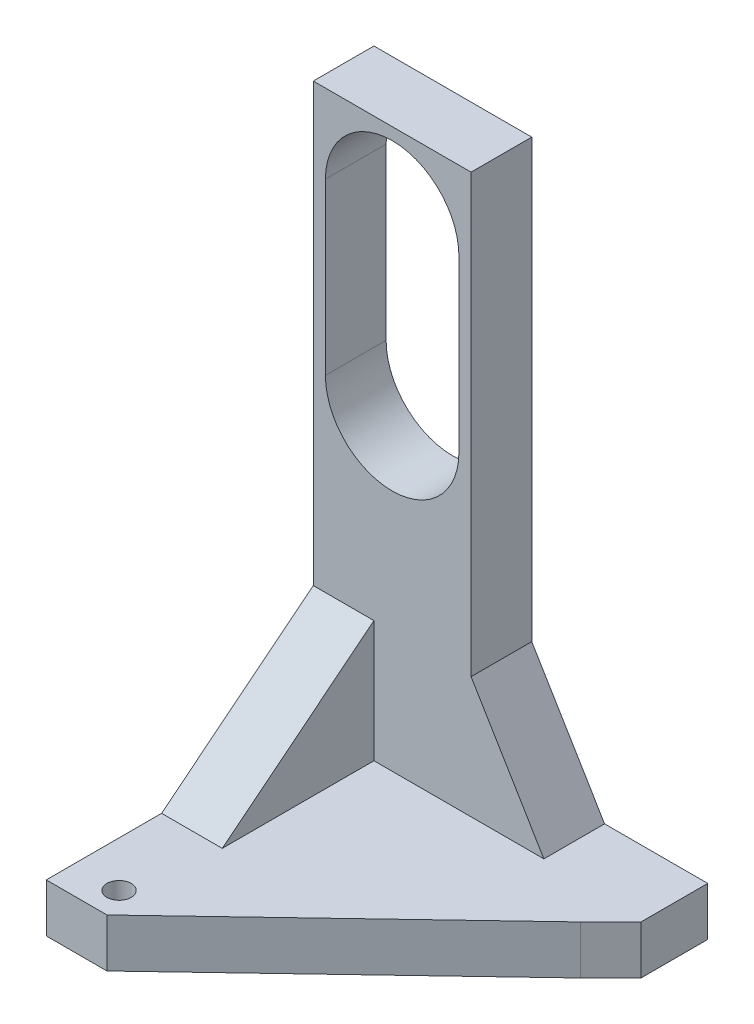
ISO-10303-21;
HEADER;
FILE_DESCRIPTION(('STEP AP214'),'2;1');
FILE_NAME('part.step','',(''),(''),'','','');
FILE_SCHEMA(('AUTOMOTIVE_DESIGN { 1 0 10303 214 1 1 1 1 }'));
ENDSEC;
DATA;
#1=APPLICATION_CONTEXT('core data for automotive mechanical design processes');
#2=APPLICATION_PROTOCOL_DEFINITION('international standard','automotive_design',2000,#1);
#3=PRODUCT_CONTEXT('',#1,'mechanical');
#4=PRODUCT('Part','Part','',(#3));
#5=PRODUCT_RELATED_PRODUCT_CATEGORY('part','',(#4));
#6=PRODUCT_DEFINITION_FORMATION('','',#4);
#7=PRODUCT_DEFINITION_CONTEXT('part definition',#1,'design');
#8=PRODUCT_DEFINITION('design','',#6,#7);
#9=PRODUCT_DEFINITION_SHAPE('','',#8);
#10=(LENGTH_UNIT() NAMED_UNIT(*) SI_UNIT(.MILLI.,.METRE.));
#11=(NAMED_UNIT(*) PLANE_ANGLE_UNIT() SI_UNIT($,.RADIAN.));
#12=(NAMED_UNIT(*) SI_UNIT($,.STERADIAN.) SOLID_ANGLE_UNIT());
#13=UNCERTAINTY_MEASURE_WITH_UNIT(LENGTH_MEASURE(1.E-05),#10,'distance_accuracy_value','');
#14=(GEOMETRIC_REPRESENTATION_CONTEXT(3) GLOBAL_UNCERTAINTY_ASSIGNED_CONTEXT((#13)) GLOBAL_UNIT_ASSIGNED_CONTEXT((#10,
#11,#12)) REPRESENTATION_CONTEXT('',''));
#15=CARTESIAN_POINT('',(0.,0.,0.));
#16=DIRECTION('',(0.,0.,1.));
#17=DIRECTION('',(1.,0.,0.));
#18=AXIS2_PLACEMENT_3D('',#15,#16,#17);
#19=CARTESIAN_POINT('',(0.,0.,10.));
#20=DIRECTION('',(0.,0.,-1.));
#21=DIRECTION('',(-1.,0.,0.));
#22=AXIS2_PLACEMENT_3D('',#19,#20,#21);
#23=PLANE('',#22);
#24=DIRECTION('',(0.,1.,0.));
#25=VECTOR('',#24,1.);
#26=CARTESIAN_POINT('',(-12.9999999999998,-58.75,10.));
#27=LINE('',#26,#25);
#28=CARTESIAN_POINT('',(-12.9999999999999,-33.7499999999995,10.));
#29=VERTEX_POINT('',#28);
#30=CARTESIAN_POINT('',(-13.0000000000001,38.25,10.));
#31=VERTEX_POINT('',#30);
#32=EDGE_CURVE('E63',#29,#31,#27,.T.);
#33=ORIENTED_EDGE('',*,*,#32,.F.);
#34=DIRECTION('',(-1.,0.,0.));
#35=VECTOR('',#34,1.);
#36=CARTESIAN_POINT('',(-2.99999999999986,-33.7499999999999,10.0000000000006));
#37=LINE('',#36,#35);
#38=CARTESIAN_POINT('',(-2.99999999999986,-33.7499999999999,10.));
#39=VERTEX_POINT('',#38);
#40=EDGE_CURVE('E58',#39,#29,#37,.T.);
#41=ORIENTED_EDGE('',*,*,#40,.F.);
#42=DIRECTION('',(0.,-1.,0.));
#43=VECTOR('',#42,1.);
#44=CARTESIAN_POINT('',(-2.99999999999986,-33.7499999999999,10.0000000000006));
#45=LINE('',#44,#43);
#46=CARTESIAN_POINT('',(-2.99999999999979,-53.75,10.0000000000006));
#47=VERTEX_POINT('',#46);
#48=EDGE_CURVE('E187',#39,#47,#45,.T.);
#49=ORIENTED_EDGE('',*,*,#48,.T.);
#50=DIRECTION('',(-1.,0.,0.));
#51=VECTOR('',#50,1.);
#52=CARTESIAN_POINT('',(13.0000000000002,-53.75,10.0000000000006));
#53=LINE('',#52,#51);
#54=CARTESIAN_POINT('',(25.0000000000002,-53.75,10.));
#55=VERTEX_POINT('',#54);
#56=EDGE_CURVE('E214',#55,#47,#53,.T.);
#57=ORIENTED_EDGE('',*,*,#56,.F.);
#58=DIRECTION('',(0.514495755427527,-0.857492925712544,0.));
#59=VECTOR('',#58,1.);
#60=CARTESIAN_POINT('',(13.0000000000002,-33.75,10.));
#61=LINE('',#60,#59);
#62=CARTESIAN_POINT('',(13.0000000000002,-33.75,10.));
#63=VERTEX_POINT('',#62);
#64=EDGE_CURVE('E201',#63,#55,#61,.T.);
#65=ORIENTED_EDGE('',*,*,#64,.F.);
#66=DIRECTION('',(0.,1.,0.));
#67=VECTOR('',#66,1.);
#68=CARTESIAN_POINT('',(13.0000000000002,-58.75,10.));
#69=LINE('',#68,#67);
#70=CARTESIAN_POINT('',(13.0000000000002,38.25,10.));
#71=VERTEX_POINT('',#70);
#72=EDGE_CURVE('E280',#63,#71,#69,.T.);
#73=ORIENTED_EDGE('',*,*,#72,.T.);
#74=DIRECTION('',(1.,0.,0.));
#75=VECTOR('',#74,1.);
#76=CARTESIAN_POINT('',(-13.0000000000001,38.25,10.));
#77=LINE('',#76,#75);
#78=EDGE_CURVE('E276',#31,#71,#77,.T.);
#79=ORIENTED_EDGE('',*,*,#78,.F.);
#80=EDGE_LOOP('',(#33,#41,#49,#57,#65,#73,#79));
#81=FACE_BOUND('',#80,.T.);
#82=CARTESIAN_POINT('',(0.,-2.75,10.));
#83=DIRECTION('',(0.,0.,1.));
#84=DIRECTION('',(1.,0.,0.));
#85=AXIS2_PLACEMENT_3D('',#82,#83,#84);
#86=CIRCLE('',#85,11.);
#87=CARTESIAN_POINT('',(-11.,-2.75,10.));
#88=VERTEX_POINT('',#87);
#89=CARTESIAN_POINT('',(11.,-2.75,10.));
#90=VERTEX_POINT('',#89);
#91=EDGE_CURVE('E244',#88,#90,#86,.T.);
#92=ORIENTED_EDGE('',*,*,#91,.F.);
#93=DIRECTION('',(0.,-1.,0.));
#94=VECTOR('',#93,1.);
#95=CARTESIAN_POINT('',(-11.,-2.75,10.));
#96=LINE('',#95,#94);
#97=CARTESIAN_POINT('',(-11.0000000000001,25.25,10.));
#98=VERTEX_POINT('',#97);
#99=EDGE_CURVE('E252',#98,#88,#96,.T.);
#100=ORIENTED_EDGE('',*,*,#99,.F.);
#101=CARTESIAN_POINT('',(0.,25.25,10.));
#102=DIRECTION('',(0.,0.,1.));
#103=DIRECTION('',(-1.,0.,0.));
#104=AXIS2_PLACEMENT_3D('',#101,#102,#103);
#105=CIRCLE('',#104,11.);
#106=CARTESIAN_POINT('',(11.,25.25,10.));
#107=VERTEX_POINT('',#106);
#108=EDGE_CURVE('E249',#107,#98,#105,.T.);
#109=ORIENTED_EDGE('',*,*,#108,.F.);
#110=DIRECTION('',(0.,1.,0.));
#111=VECTOR('',#110,1.);
#112=CARTESIAN_POINT('',(11.,-2.75,10.));
#113=LINE('',#112,#111);
#114=EDGE_CURVE('E246',#90,#107,#113,.T.);
#115=ORIENTED_EDGE('',*,*,#114,.F.);
#116=EDGE_LOOP('',(#92,#100,#109,#115));
#117=FACE_BOUND('',#116,.T.);
#118=ADVANCED_FACE('F43',(#81,#117),#23,.F.);
#119=CARTESIAN_POINT('',(0.,0.,0.));
#120=DIRECTION('',(0.,0.,-1.));
#121=DIRECTION('',(-1.,0.,0.));
#122=AXIS2_PLACEMENT_3D('',#119,#120,#121);
#123=PLANE('',#122);
#124=DIRECTION('',(0.,1.,0.));
#125=VECTOR('',#124,1.);
#126=CARTESIAN_POINT('',(13.0000000000002,-58.75,0.));
#127=LINE('',#126,#125);
#128=CARTESIAN_POINT('',(13.0000000000002,-33.75,0.));
#129=VERTEX_POINT('',#128);
#130=CARTESIAN_POINT('',(13.0000000000002,38.25,0.));
#131=VERTEX_POINT('',#130);
#132=EDGE_CURVE('E277',#129,#131,#127,.T.);
#133=ORIENTED_EDGE('',*,*,#132,.F.);
#134=DIRECTION('',(0.514495755427527,-0.857492925712544,0.));
#135=VECTOR('',#134,1.);
#136=CARTESIAN_POINT('',(13.0000000000002,-33.75,0.));
#137=LINE('',#136,#135);
#138=CARTESIAN_POINT('',(25.0000000000002,-53.75,3.01841884819965E-13));
#139=VERTEX_POINT('',#138);
#140=EDGE_CURVE('E198',#129,#139,#137,.T.);
#141=ORIENTED_EDGE('',*,*,#140,.T.);
#142=DIRECTION('',(-1.,0.,0.));
#143=VECTOR('',#142,1.);
#144=CARTESIAN_POINT('',(37.0000000000002,-53.75,0.));
#145=LINE('',#144,#143);
#146=CARTESIAN_POINT('',(42.0000000000002,-53.75,0.));
#147=VERTEX_POINT('',#146);
#148=EDGE_CURVE('E225',#147,#139,#145,.T.);
#149=ORIENTED_EDGE('',*,*,#148,.F.);
#150=DIRECTION('',(0.,1.,0.));
#151=VECTOR('',#150,1.);
#152=CARTESIAN_POINT('',(42.0000000000002,-61.75,0.));
#153=LINE('',#152,#151);
#154=CARTESIAN_POINT('',(42.0000000000002,-61.75,0.));
#155=VERTEX_POINT('',#154);
#156=EDGE_CURVE('E164',#155,#147,#153,.T.);
#157=ORIENTED_EDGE('',*,*,#156,.F.);
#158=DIRECTION('',(1.,0.,0.));
#159=VECTOR('',#158,1.);
#160=CARTESIAN_POINT('',(-12.9999999999998,-61.75,0.));
#161=LINE('',#160,#159);
#162=CARTESIAN_POINT('',(-12.9999999999998,-61.75,0.));
#163=VERTEX_POINT('',#162);
#164=EDGE_CURVE('E173',#163,#155,#161,.T.);
#165=ORIENTED_EDGE('',*,*,#164,.F.);
#166=DIRECTION('',(0.,1.,0.));
#167=VECTOR('',#166,1.);
#168=CARTESIAN_POINT('',(-12.9999999999998,-58.75,0.));
#169=LINE('',#168,#167);
#170=CARTESIAN_POINT('',(-13.0000000000001,38.25,0.));
#171=VERTEX_POINT('',#170);
#172=EDGE_CURVE('E274',#163,#171,#169,.T.);
#173=ORIENTED_EDGE('',*,*,#172,.T.);
#174=DIRECTION('',(1.,0.,0.));
#175=VECTOR('',#174,1.);
#176=CARTESIAN_POINT('',(-13.0000000000001,38.25,0.));
#177=LINE('',#176,#175);
#178=EDGE_CURVE('E284',#171,#131,#177,.T.);
#179=ORIENTED_EDGE('',*,*,#178,.T.);
#180=EDGE_LOOP('',(#133,#141,#149,#157,#165,#173,#179));
#181=FACE_BOUND('',#180,.T.);
#182=DIRECTION('',(0.,-1.,0.));
#183=VECTOR('',#182,1.);
#184=CARTESIAN_POINT('',(-11.,-2.75,0.));
#185=LINE('',#184,#183);
#186=CARTESIAN_POINT('',(-11.0000000000001,25.25,0.));
#187=VERTEX_POINT('',#186);
#188=CARTESIAN_POINT('',(-11.,-2.75,0.));
#189=VERTEX_POINT('',#188);
#190=EDGE_CURVE('E247',#187,#189,#185,.T.);
#191=ORIENTED_EDGE('',*,*,#190,.T.);
#192=CARTESIAN_POINT('',(0.,-2.75,0.));
#193=DIRECTION('',(0.,0.,1.));
#194=DIRECTION('',(1.,0.,0.));
#195=AXIS2_PLACEMENT_3D('',#192,#193,#194);
#196=CIRCLE('',#195,11.);
#197=CARTESIAN_POINT('',(11.,-2.75,0.));
#198=VERTEX_POINT('',#197);
#199=EDGE_CURVE('E243',#189,#198,#196,.T.);
#200=ORIENTED_EDGE('',*,*,#199,.T.);
#201=DIRECTION('',(0.,1.,0.));
#202=VECTOR('',#201,1.);
#203=CARTESIAN_POINT('',(11.,-2.75,0.));
#204=LINE('',#203,#202);
#205=CARTESIAN_POINT('',(11.,25.25,0.));
#206=VERTEX_POINT('',#205);
#207=EDGE_CURVE('E257',#198,#206,#204,.T.);
#208=ORIENTED_EDGE('',*,*,#207,.T.);
#209=CARTESIAN_POINT('',(0.,25.25,0.));
#210=DIRECTION('',(0.,0.,1.));
#211=DIRECTION('',(-1.,0.,0.));
#212=AXIS2_PLACEMENT_3D('',#209,#210,#211);
#213=CIRCLE('',#212,11.);
#214=EDGE_CURVE('E260',#206,#187,#213,.T.);
#215=ORIENTED_EDGE('',*,*,#214,.T.);
#216=EDGE_LOOP('',(#191,#200,#208,#215));
#217=FACE_BOUND('',#216,.T.);
#218=ADVANCED_FACE('F298',(#181,#217),#123,.T.);
#219=CARTESIAN_POINT('',(13.0000000000002,-58.75,10.));
#220=DIRECTION('',(-1.,0.,0.));
#221=DIRECTION('',(0.,0.,1.));
#222=AXIS2_PLACEMENT_3D('',#219,#220,#221);
#223=PLANE('',#222);
#224=ORIENTED_EDGE('',*,*,#72,.F.);
#225=DIRECTION('',(0.,0.,-1.));
#226=VECTOR('',#225,1.);
#227=CARTESIAN_POINT('',(13.0000000000002,-33.75,10.));
#228=LINE('',#227,#226);
#229=EDGE_CURVE('E204',#63,#129,#228,.T.);
#230=ORIENTED_EDGE('',*,*,#229,.T.);
#231=ORIENTED_EDGE('',*,*,#132,.T.);
#232=DIRECTION('',(0.,0.,-1.));
#233=VECTOR('',#232,1.);
#234=CARTESIAN_POINT('',(13.0000000000002,38.25,10.));
#235=LINE('',#234,#233);
#236=EDGE_CURVE('E11',#71,#131,#235,.T.);
#237=ORIENTED_EDGE('',*,*,#236,.F.);
#238=EDGE_LOOP('',(#224,#230,#231,#237));
#239=FACE_BOUND('',#238,.T.);
#240=ADVANCED_FACE('F290',(#239),#223,.F.);
#241=CARTESIAN_POINT('',(-13.0000000000001,38.25,10.));
#242=DIRECTION('',(0.,1.,0.));
#243=DIRECTION('',(0.,0.,1.));
#244=AXIS2_PLACEMENT_3D('',#241,#242,#243);
#245=PLANE('',#244);
#246=ORIENTED_EDGE('',*,*,#178,.F.);
#247=DIRECTION('',(0.,0.,-1.));
#248=VECTOR('',#247,1.);
#249=CARTESIAN_POINT('',(-13.0000000000001,38.25,10.));
#250=LINE('',#249,#248);
#251=EDGE_CURVE('E47',#31,#171,#250,.T.);
#252=ORIENTED_EDGE('',*,*,#251,.F.);
#253=ORIENTED_EDGE('',*,*,#78,.T.);
#254=ORIENTED_EDGE('',*,*,#236,.T.);
#255=EDGE_LOOP('',(#246,#252,#253,#254));
#256=FACE_BOUND('',#255,.T.);
#257=ADVANCED_FACE('F296',(#256),#245,.T.);
#258=CARTESIAN_POINT('',(-12.9999999999998,-58.75,10.));
#259=DIRECTION('',(-1.,0.,0.));
#260=DIRECTION('',(0.,-1.,0.));
#261=AXIS2_PLACEMENT_3D('',#258,#259,#260);
#262=PLANE('',#261);
#263=DIRECTION('',(0.,0.624695047554424,-0.78086880944303));
#264=VECTOR('',#263,1.);
#265=CARTESIAN_POINT('',(-12.9999999999999,-33.75,10.0000000000006));
#266=LINE('',#265,#264);
#267=CARTESIAN_POINT('',(-12.9999999999998,-53.75,35.0000000000006));
#268=VERTEX_POINT('',#267);
#269=EDGE_CURVE('E185',#268,#29,#266,.T.);
#270=ORIENTED_EDGE('',*,*,#269,.T.);
#271=ORIENTED_EDGE('',*,*,#32,.T.);
#272=ORIENTED_EDGE('',*,*,#251,.T.);
#273=ORIENTED_EDGE('',*,*,#172,.F.);
#274=DIRECTION('',(0.,0.,-1.));
#275=VECTOR('',#274,1.);
#276=CARTESIAN_POINT('',(-12.9999999999998,-61.75,0.));
#277=LINE('',#276,#275);
#278=CARTESIAN_POINT('',(-13.,-61.7499999999997,54.));
#279=VERTEX_POINT('',#278);
#280=EDGE_CURVE('E232',#279,#163,#277,.T.);
#281=ORIENTED_EDGE('',*,*,#280,.F.);
#282=DIRECTION('',(0.,1.,0.));
#283=VECTOR('',#282,1.);
#284=CARTESIAN_POINT('',(-13.,-61.7499999999997,54.));
#285=LINE('',#284,#283);
#286=CARTESIAN_POINT('',(-13.,-53.7499999999997,54.));
#287=VERTEX_POINT('',#286);
#288=EDGE_CURVE('E240',#279,#287,#285,.T.);
#289=ORIENTED_EDGE('',*,*,#288,.T.);
#290=DIRECTION('',(0.,0.,1.));
#291=VECTOR('',#290,1.);
#292=CARTESIAN_POINT('',(-13.0000000000001,-53.75,10.0000000000006));
#293=LINE('',#292,#291);
#294=EDGE_CURVE('E217',#268,#287,#293,.T.);
#295=ORIENTED_EDGE('',*,*,#294,.F.);
#296=EDGE_LOOP('',(#270,#271,#272,#273,#281,#289,#295));
#297=FACE_BOUND('',#296,.T.);
#298=ADVANCED_FACE('F45',(#297),#262,.T.);
#299=CARTESIAN_POINT('',(0.,-2.75,10.));
#300=DIRECTION('',(0.,0.,-1.));
#301=DIRECTION('',(-1.,0.,0.));
#302=AXIS2_PLACEMENT_3D('',#299,#300,#301);
#303=CYLINDRICAL_SURFACE('',#302,11.);
#304=ORIENTED_EDGE('',*,*,#199,.F.);
#305=DIRECTION('',(0.,0.,-1.));
#306=VECTOR('',#305,1.);
#307=CARTESIAN_POINT('',(-11.,-2.75,10.));
#308=LINE('',#307,#306);
#309=EDGE_CURVE('E254',#88,#189,#308,.T.);
#310=ORIENTED_EDGE('',*,*,#309,.F.);
#311=ORIENTED_EDGE('',*,*,#91,.T.);
#312=DIRECTION('',(0.,0.,-1.));
#313=VECTOR('',#312,1.);
#314=CARTESIAN_POINT('',(11.,-2.75,10.));
#315=LINE('',#314,#313);
#316=EDGE_CURVE('E271',#90,#198,#315,.T.);
#317=ORIENTED_EDGE('',*,*,#316,.T.);
#318=EDGE_LOOP('',(#304,#310,#311,#317));
#319=FACE_BOUND('',#318,.T.);
#320=ADVANCED_FACE('F347',(#319),#303,.F.);
#321=CARTESIAN_POINT('',(11.,-2.75,10.));
#322=DIRECTION('',(-1.,0.,0.));
#323=DIRECTION('',(0.,-1.,0.));
#324=AXIS2_PLACEMENT_3D('',#321,#322,#323);
#325=PLANE('',#324);
#326=ORIENTED_EDGE('',*,*,#207,.F.);
#327=ORIENTED_EDGE('',*,*,#316,.F.);
#328=ORIENTED_EDGE('',*,*,#114,.T.);
#329=DIRECTION('',(0.,0.,-1.));
#330=VECTOR('',#329,1.);
#331=CARTESIAN_POINT('',(11.,25.25,10.));
#332=LINE('',#331,#330);
#333=EDGE_CURVE('E269',#107,#206,#332,.T.);
#334=ORIENTED_EDGE('',*,*,#333,.T.);
#335=EDGE_LOOP('',(#326,#327,#328,#334));
#336=FACE_BOUND('',#335,.T.);
#337=ADVANCED_FACE('F357',(#336),#325,.T.);
#338=CARTESIAN_POINT('',(0.,25.25,10.));
#339=DIRECTION('',(0.,0.,-1.));
#340=DIRECTION('',(-1.,0.,0.));
#341=AXIS2_PLACEMENT_3D('',#338,#339,#340);
#342=CYLINDRICAL_SURFACE('',#341,11.);
#343=ORIENTED_EDGE('',*,*,#214,.F.);
#344=ORIENTED_EDGE('',*,*,#333,.F.);
#345=ORIENTED_EDGE('',*,*,#108,.T.);
#346=DIRECTION('',(0.,0.,-1.));
#347=VECTOR('',#346,1.);
#348=CARTESIAN_POINT('',(-11.0000000000001,25.25,10.));
#349=LINE('',#348,#347);
#350=EDGE_CURVE('E267',#98,#187,#349,.T.);
#351=ORIENTED_EDGE('',*,*,#350,.T.);
#352=EDGE_LOOP('',(#343,#344,#345,#351));
#353=FACE_BOUND('',#352,.T.);
#354=ADVANCED_FACE('F362',(#353),#342,.F.);
#355=CARTESIAN_POINT('',(-11.,-2.75,10.));
#356=DIRECTION('',(1.,0.,0.));
#357=DIRECTION('',(0.,1.,0.));
#358=AXIS2_PLACEMENT_3D('',#355,#356,#357);
#359=PLANE('',#358);
#360=ORIENTED_EDGE('',*,*,#190,.F.);
#361=ORIENTED_EDGE('',*,*,#350,.F.);
#362=ORIENTED_EDGE('',*,*,#99,.T.);
#363=ORIENTED_EDGE('',*,*,#309,.T.);
#364=EDGE_LOOP('',(#360,#361,#362,#363));
#365=FACE_BOUND('',#364,.T.);
#366=ADVANCED_FACE('F337',(#365),#359,.T.);
#367=CARTESIAN_POINT('',(-13.,-61.7499999999997,54.));
#368=DIRECTION('',(0.,0.,-1.));
#369=DIRECTION('',(0.,1.,0.));
#370=AXIS2_PLACEMENT_3D('',#367,#368,#369);
#371=PLANE('',#370);
#372=DIRECTION('',(0.,1.,0.));
#373=VECTOR('',#372,1.);
#374=CARTESIAN_POINT('',(-2.99999999999996,-61.7499999999997,54.));
#375=LINE('',#374,#373);
#376=CARTESIAN_POINT('',(-2.99999999999996,-61.7499999999997,54.));
#377=VERTEX_POINT('',#376);
#378=CARTESIAN_POINT('',(-2.99999999999996,-53.7499999999997,54.));
#379=VERTEX_POINT('',#378);
#380=EDGE_CURVE('E237',#377,#379,#375,.T.);
#381=ORIENTED_EDGE('',*,*,#380,.T.);
#382=DIRECTION('',(1.,0.,0.));
#383=VECTOR('',#382,1.);
#384=CARTESIAN_POINT('',(-13.,-53.7499999999997,54.));
#385=LINE('',#384,#383);
#386=EDGE_CURVE('E219',#287,#379,#385,.T.);
#387=ORIENTED_EDGE('',*,*,#386,.F.);
#388=ORIENTED_EDGE('',*,*,#288,.F.);
#389=DIRECTION('',(-1.,0.,0.));
#390=VECTOR('',#389,1.);
#391=CARTESIAN_POINT('',(-13.,-61.7499999999997,54.));
#392=LINE('',#391,#390);
#393=EDGE_CURVE('E230',#377,#279,#392,.T.);
#394=ORIENTED_EDGE('',*,*,#393,.F.);
#395=EDGE_LOOP('',(#381,#387,#388,#394));
#396=FACE_BOUND('',#395,.T.);
#397=ADVANCED_FACE('F306',(#396),#371,.F.);
#398=CARTESIAN_POINT('',(-2.99999999999996,-61.7499999999997,54.));
#399=DIRECTION('',(-0.688749461914692,0.,-0.724999433594415));
#400=DIRECTION('',(-0.724999433594415,0.,0.688749461914692));
#401=AXIS2_PLACEMENT_3D('',#398,#399,#400);
#402=PLANE('',#401);
#403=DIRECTION('',(0.,1.,0.));
#404=VECTOR('',#403,1.);
#405=CARTESIAN_POINT('',(37.0000000000002,-61.7499999999999,16.));
#406=LINE('',#405,#404);
#407=CARTESIAN_POINT('',(37.0000000000002,-61.7499999999999,16.));
#408=VERTEX_POINT('',#407);
#409=CARTESIAN_POINT('',(37.0000000000002,-53.7499999999999,16.));
#410=VERTEX_POINT('',#409);
#411=EDGE_CURVE('E178',#408,#410,#406,.T.);
#412=ORIENTED_EDGE('',*,*,#411,.T.);
#413=DIRECTION('',(0.724999433594415,0.,-0.688749461914692));
#414=VECTOR('',#413,1.);
#415=CARTESIAN_POINT('',(-2.99999999999996,-53.7499999999997,54.));
#416=LINE('',#415,#414);
#417=EDGE_CURVE('E222',#379,#410,#416,.T.);
#418=ORIENTED_EDGE('',*,*,#417,.F.);
#419=ORIENTED_EDGE('',*,*,#380,.F.);
#420=DIRECTION('',(-0.724999433594415,0.,0.688749461914692));
#421=VECTOR('',#420,1.);
#422=CARTESIAN_POINT('',(-2.99999999999996,-61.7499999999997,54.));
#423=LINE('',#422,#421);
#424=EDGE_CURVE('E235',#408,#377,#423,.T.);
#425=ORIENTED_EDGE('',*,*,#424,.F.);
#426=EDGE_LOOP('',(#412,#418,#419,#425));
#427=FACE_BOUND('',#426,.T.);
#428=ADVANCED_FACE('F325',(#427),#402,.F.);
#429=CARTESIAN_POINT('',(0.,-61.75,4.28792601907481E-13));
#430=DIRECTION('',(0.,-1.,0.));
#431=DIRECTION('',(0.,0.,-1.));
#432=AXIS2_PLACEMENT_3D('',#429,#430,#431);
#433=PLANE('',#432);
#434=CARTESIAN_POINT('',(-5.49999999999995,-61.7499999999995,49.5));
#435=DIRECTION('',(0.,-1.,0.));
#436=DIRECTION('',(0.,0.,-1.));
#437=AXIS2_PLACEMENT_3D('',#434,#435,#436);
#438=CIRCLE('',#437,2.);
#439=CARTESIAN_POINT('',(-5.49999999999995,-61.7499999999995,47.5));
#440=VERTEX_POINT('',#439);
#441=EDGE_CURVE('E227',#440,#440,#438,.T.);
#442=ORIENTED_EDGE('',*,*,#441,.F.);
#443=EDGE_LOOP('',(#442));
#444=FACE_BOUND('',#443,.T.);
#445=ORIENTED_EDGE('',*,*,#393,.T.);
#446=ORIENTED_EDGE('',*,*,#280,.T.);
#447=ORIENTED_EDGE('',*,*,#164,.T.);
#448=DIRECTION('',(0.,0.,-1.));
#449=VECTOR('',#448,1.);
#450=CARTESIAN_POINT('',(42.0000000000002,-61.75,11.));
#451=LINE('',#450,#449);
#452=CARTESIAN_POINT('',(42.0000000000002,-61.75,11.));
#453=VERTEX_POINT('',#452);
#454=EDGE_CURVE('E158',#453,#155,#451,.T.);
#455=ORIENTED_EDGE('',*,*,#454,.F.);
#456=DIRECTION('',(0.707106781186546,0.,-0.707106781186549));
#457=VECTOR('',#456,1.);
#458=CARTESIAN_POINT('',(37.0000000000002,-61.7499999999999,16.));
#459=LINE('',#458,#457);
#460=EDGE_CURVE('E169',#408,#453,#459,.T.);
#461=ORIENTED_EDGE('',*,*,#460,.F.);
#462=ORIENTED_EDGE('',*,*,#424,.T.);
#463=EDGE_LOOP('',(#445,#446,#447,#455,#461,#462));
#464=FACE_BOUND('',#463,.T.);
#465=ADVANCED_FACE('F168',(#444,#464),#433,.T.);
#466=CARTESIAN_POINT('',(-5.49999999999995,-58.7499999999994,49.5));
#467=DIRECTION('',(0.,-1.,0.));
#468=DIRECTION('',(0.,0.,-1.));
#469=AXIS2_PLACEMENT_3D('',#466,#467,#468);
#470=CYLINDRICAL_SURFACE('',#469,2.);
#471=ORIENTED_EDGE('',*,*,#441,.T.);
#472=EDGE_LOOP('',(#471));
#473=FACE_BOUND('',#472,.T.);
#474=CARTESIAN_POINT('',(-5.49999999999998,-53.7499999999997,49.5));
#475=DIRECTION('',(0.,1.,0.));
#476=DIRECTION('',(0.,0.,1.));
#477=AXIS2_PLACEMENT_3D('',#474,#475,#476);
#478=CIRCLE('',#477,2.);
#479=CARTESIAN_POINT('',(-5.49999999999998,-53.7499999999997,51.5));
#480=VERTEX_POINT('',#479);
#481=EDGE_CURVE('E210',#480,#480,#478,.T.);
#482=ORIENTED_EDGE('',*,*,#481,.T.);
#483=EDGE_LOOP('',(#482));
#484=FACE_BOUND('',#483,.T.);
#485=ADVANCED_FACE('F333',(#473,#484),#470,.F.);
#486=CARTESIAN_POINT('',(0.,-53.75,3.7296554733502E-13));
#487=DIRECTION('',(0.,1.,0.));
#488=DIRECTION('',(0.,0.,1.));
#489=AXIS2_PLACEMENT_3D('',#486,#487,#488);
#490=PLANE('',#489);
#491=DIRECTION('',(-1.,0.,0.));
#492=VECTOR('',#491,1.);
#493=CARTESIAN_POINT('',(-2.99999999999979,-53.7499999999999,35.0000000000006));
#494=LINE('',#493,#492);
#495=CARTESIAN_POINT('',(-2.99999999999979,-53.7499999999998,35.0000000000006));
#496=VERTEX_POINT('',#495);
#497=EDGE_CURVE('E194',#496,#268,#494,.T.);
#498=ORIENTED_EDGE('',*,*,#497,.T.);
#499=ORIENTED_EDGE('',*,*,#294,.T.);
#500=ORIENTED_EDGE('',*,*,#386,.T.);
#501=ORIENTED_EDGE('',*,*,#417,.T.);
#502=DIRECTION('',(0.707106781186546,0.,-0.707106781186549));
#503=VECTOR('',#502,1.);
#504=CARTESIAN_POINT('',(37.0000000000002,-53.7499999999999,16.));
#505=LINE('',#504,#503);
#506=CARTESIAN_POINT('',(42.0000000000002,-53.75,10.9999999999999));
#507=VERTEX_POINT('',#506);
#508=EDGE_CURVE('E181',#410,#507,#505,.T.);
#509=ORIENTED_EDGE('',*,*,#508,.T.);
#510=DIRECTION('',(0.,0.,-1.));
#511=VECTOR('',#510,1.);
#512=CARTESIAN_POINT('',(42.0000000000002,-53.75,10.9999999999999));
#513=LINE('',#512,#511);
#514=EDGE_CURVE('E160',#507,#147,#513,.T.);
#515=ORIENTED_EDGE('',*,*,#514,.T.);
#516=ORIENTED_EDGE('',*,*,#148,.T.);
#517=DIRECTION('',(0.,0.,-1.));
#518=VECTOR('',#517,1.);
#519=CARTESIAN_POINT('',(25.0000000000002,-53.75,10.));
#520=LINE('',#519,#518);
#521=EDGE_CURVE('E207',#55,#139,#520,.T.);
#522=ORIENTED_EDGE('',*,*,#521,.F.);
#523=ORIENTED_EDGE('',*,*,#56,.T.);
#524=DIRECTION('',(0.,0.,1.));
#525=VECTOR('',#524,1.);
#526=CARTESIAN_POINT('',(-2.99999999999979,-53.7499999999999,10.0000000000006));
#527=LINE('',#526,#525);
#528=EDGE_CURVE('E189',#47,#496,#527,.T.);
#529=ORIENTED_EDGE('',*,*,#528,.T.);
#530=EDGE_LOOP('',(#498,#499,#500,#501,#509,#515,#516,#522,#523,#529));
#531=FACE_BOUND('',#530,.T.);
#532=ORIENTED_EDGE('',*,*,#481,.F.);
#533=EDGE_LOOP('',(#532));
#534=FACE_BOUND('',#533,.T.);
#535=ADVANCED_FACE('F310',(#531,#534),#490,.T.);
#536=CARTESIAN_POINT('',(13.0000000000002,-33.75,10.));
#537=DIRECTION('',(0.857492925712544,0.514495755427526,0.));
#538=DIRECTION('',(-0.514495755427527,0.857492925712544,0.));
#539=AXIS2_PLACEMENT_3D('',#536,#537,#538);
#540=PLANE('',#539);
#541=ORIENTED_EDGE('',*,*,#140,.F.);
#542=ORIENTED_EDGE('',*,*,#229,.F.);
#543=ORIENTED_EDGE('',*,*,#64,.T.);
#544=ORIENTED_EDGE('',*,*,#521,.T.);
#545=EDGE_LOOP('',(#541,#542,#543,#544));
#546=FACE_BOUND('',#545,.T.);
#547=ADVANCED_FACE('F322',(#546),#540,.T.);
#548=CARTESIAN_POINT('',(-2.99999999999986,-33.7499999999999,10.0000000000006));
#549=DIRECTION('',(0.,0.78086880944303,0.624695047554424));
#550=DIRECTION('',(0.,-0.624695047554424,0.78086880944303));
#551=AXIS2_PLACEMENT_3D('',#548,#549,#550);
#552=PLANE('',#551);
#553=ORIENTED_EDGE('',*,*,#269,.F.);
#554=ORIENTED_EDGE('',*,*,#497,.F.);
#555=DIRECTION('',(0.,0.624695047554424,-0.78086880944303));
#556=VECTOR('',#555,1.);
#557=CARTESIAN_POINT('',(-2.99999999999986,-33.7499999999999,10.0000000000006));
#558=LINE('',#557,#556);
#559=EDGE_CURVE('E191',#496,#39,#558,.T.);
#560=ORIENTED_EDGE('',*,*,#559,.T.);
#561=ORIENTED_EDGE('',*,*,#40,.T.);
#562=EDGE_LOOP('',(#553,#554,#560,#561));
#563=FACE_BOUND('',#562,.T.);
#564=ADVANCED_FACE('F315',(#563),#552,.T.);
#565=CARTESIAN_POINT('',(-2.99999999999998,0.,0.));
#566=DIRECTION('',(-1.,0.,0.));
#567=DIRECTION('',(0.,-1.,0.));
#568=AXIS2_PLACEMENT_3D('',#565,#566,#567);
#569=PLANE('',#568);
#570=ORIENTED_EDGE('',*,*,#48,.F.);
#571=ORIENTED_EDGE('',*,*,#559,.F.);
#572=ORIENTED_EDGE('',*,*,#528,.F.);
#573=EDGE_LOOP('',(#570,#571,#572));
#574=FACE_BOUND('',#573,.T.);
#575=ADVANCED_FACE('F317',(#574),#569,.F.);
#576=CARTESIAN_POINT('',(37.0000000000002,-61.7499999999999,16.));
#577=DIRECTION('',(0.707106781186549,0.,0.707106781186546));
#578=DIRECTION('',(0.707106781186546,0.,-0.707106781186549));
#579=AXIS2_PLACEMENT_3D('',#576,#577,#578);
#580=PLANE('',#579);
#581=ORIENTED_EDGE('',*,*,#508,.F.);
#582=ORIENTED_EDGE('',*,*,#411,.F.);
#583=ORIENTED_EDGE('',*,*,#460,.T.);
#584=DIRECTION('',(0.,1.,0.));
#585=VECTOR('',#584,1.);
#586=CARTESIAN_POINT('',(42.0000000000002,-61.75,11.));
#587=LINE('',#586,#585);
#588=EDGE_CURVE('E154',#453,#507,#587,.T.);
#589=ORIENTED_EDGE('',*,*,#588,.T.);
#590=EDGE_LOOP('',(#581,#582,#583,#589));
#591=FACE_BOUND('',#590,.T.);
#592=ADVANCED_FACE('F176',(#591),#580,.T.);
#593=CARTESIAN_POINT('',(42.0000000000002,-61.75,11.));
#594=DIRECTION('',(1.,0.,0.));
#595=DIRECTION('',(0.,0.,-1.));
#596=AXIS2_PLACEMENT_3D('',#593,#594,#595);
#597=PLANE('',#596);
#598=ORIENTED_EDGE('',*,*,#514,.F.);
#599=ORIENTED_EDGE('',*,*,#588,.F.);
#600=ORIENTED_EDGE('',*,*,#454,.T.);
#601=ORIENTED_EDGE('',*,*,#156,.T.);
#602=EDGE_LOOP('',(#598,#599,#600,#601));
#603=FACE_BOUND('',#602,.T.);
#604=ADVANCED_FACE('F156',(#603),#597,.T.);
#605=CLOSED_SHELL('',(#118,#218,#240,#257,#298,#320,#337,#354,#366,#397,#428,#465,#485,#535,
#547,#564,#575,#592,#604));
#606=MANIFOLD_SOLID_BREP('B2',#605);
#607=ADVANCED_BREP_SHAPE_REPRESENTATION('',(#18,#606),#14);
#608=SHAPE_DEFINITION_REPRESENTATION(#9,#607);
ENDSEC;
END-ISO-10303-21;
